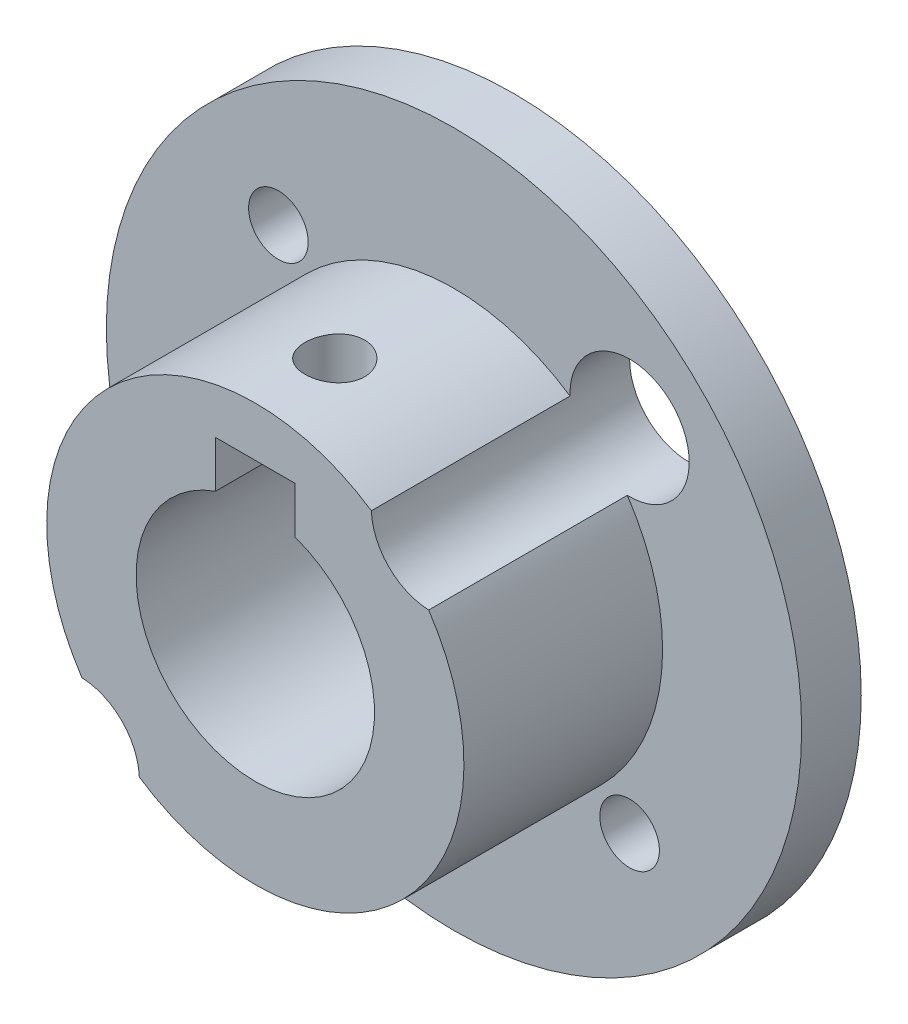
ISO-10303-21;
HEADER;
FILE_DESCRIPTION(('STEP AP214'),'2;1');
FILE_NAME('part.step','',(''),(''),'','','');
FILE_SCHEMA(('AUTOMOTIVE_DESIGN { 1 0 10303 214 1 1 1 1 }'));
ENDSEC;
DATA;
#1=APPLICATION_CONTEXT('core data for automotive mechanical design processes');
#2=APPLICATION_PROTOCOL_DEFINITION('international standard','automotive_design',2000,#1);
#3=PRODUCT_CONTEXT('',#1,'mechanical');
#4=PRODUCT('Part','Part','',(#3));
#5=PRODUCT_RELATED_PRODUCT_CATEGORY('part','',(#4));
#6=PRODUCT_DEFINITION_FORMATION('','',#4);
#7=PRODUCT_DEFINITION_CONTEXT('part definition',#1,'design');
#8=PRODUCT_DEFINITION('design','',#6,#7);
#9=PRODUCT_DEFINITION_SHAPE('','',#8);
#10=(LENGTH_UNIT() NAMED_UNIT(*) SI_UNIT(.MILLI.,.METRE.));
#11=(NAMED_UNIT(*) PLANE_ANGLE_UNIT() SI_UNIT($,.RADIAN.));
#12=(NAMED_UNIT(*) SI_UNIT($,.STERADIAN.) SOLID_ANGLE_UNIT());
#13=UNCERTAINTY_MEASURE_WITH_UNIT(LENGTH_MEASURE(1.E-05),#10,'distance_accuracy_value','');
#14=(GEOMETRIC_REPRESENTATION_CONTEXT(3) GLOBAL_UNCERTAINTY_ASSIGNED_CONTEXT((#13)) GLOBAL_UNIT_ASSIGNED_CONTEXT((#10,
#11,#12)) REPRESENTATION_CONTEXT('',''));
#15=CARTESIAN_POINT('',(0.,0.,0.));
#16=DIRECTION('',(0.,0.,1.));
#17=DIRECTION('',(1.,0.,0.));
#18=AXIS2_PLACEMENT_3D('',#15,#16,#17);
#19=CARTESIAN_POINT('',(0.,0.,10.));
#20=DIRECTION('',(0.,0.,-1.));
#21=DIRECTION('',(-1.,0.,0.));
#22=AXIS2_PLACEMENT_3D('',#19,#20,#21);
#23=CYLINDRICAL_SURFACE('',#22,10.5);
#24=CARTESIAN_POINT('',(0.,10.5,4.5));
#25=CARTESIAN_POINT('',(-0.083798047059616,10.4999987028432,4.50000348988322));
#26=CARTESIAN_POINT('',(-0.167645858243275,10.4989863030044,4.5070458107391));
#27=CARTESIAN_POINT('',(-0.333000990552121,10.4950450575882,4.53502370435099));
#28=CARTESIAN_POINT('',(-0.414505898300218,10.4921143049446,4.55597310265557));
#29=CARTESIAN_POINT('',(-0.572758015178163,10.4846659524273,4.61112909260134));
#30=CARTESIAN_POINT('',(-0.649508654024656,10.4801495125244,4.64532599523976));
#31=CARTESIAN_POINT('',(-0.796169475360476,10.4700298362088,4.72598331434304));
#32=CARTESIAN_POINT('',(-0.866080673157975,10.4644267614753,4.77244190677437));
#33=CARTESIAN_POINT('',(-0.997587975595969,10.4527130868134,4.8766562567509));
#34=CARTESIAN_POINT('',(-1.05912838620098,10.4465994865122,4.93448196428687));
#35=CARTESIAN_POINT('',(-1.17166693765294,10.4345774973183,5.05963862180949));
#36=CARTESIAN_POINT('',(-1.22266449406305,10.4286691198171,5.12697009839478));
#37=CARTESIAN_POINT('',(-1.31288381463334,10.4176973473603,5.26959767408063));
#38=CARTESIAN_POINT('',(-1.35205218821083,10.4126378279944,5.34492786942773));
#39=CARTESIAN_POINT('',(-1.41716017750215,10.4039772398443,5.50118180923658));
#40=CARTESIAN_POINT('',(-1.44310044681748,10.4003760990032,5.58210527710999));
#41=CARTESIAN_POINT('',(-1.48084398009175,10.3950692906489,5.74666501474203));
#42=CARTESIAN_POINT('',(-1.49274223279193,10.393350892854,5.83027907989174));
#43=CARTESIAN_POINT('',(-1.50235815011353,10.3919654076813,5.9983333581522));
#44=CARTESIAN_POINT('',(-1.50007655440469,10.3922982133056,6.08277352794108));
#45=CARTESIAN_POINT('',(-1.48147527146911,10.3949658865654,6.24941481799961));
#46=CARTESIAN_POINT('',(-1.46526102269474,10.3972857165318,6.33162798306878));
#47=CARTESIAN_POINT('',(-1.41941958482143,10.4036425753426,6.4921546294264));
#48=CARTESIAN_POINT('',(-1.38979204871222,10.4076796486131,6.57046800976675));
#49=CARTESIAN_POINT('',(-1.3178542818743,10.4170328660292,6.72129490966264));
#50=CARTESIAN_POINT('',(-1.27549903967451,10.4223535362188,6.7937866685787));
#51=CARTESIAN_POINT('',(-1.17934026858057,10.433671108351,6.93067381828395));
#52=CARTESIAN_POINT('',(-1.12553605726883,10.4396680505927,6.99506872609492));
#53=CARTESIAN_POINT('',(-1.00742618807158,10.4517290352068,7.11454560467195));
#54=CARTESIAN_POINT('',(-0.943029806366413,10.457793193268,7.16953791758994));
#55=CARTESIAN_POINT('',(-0.805873739101333,10.4692547684339,7.2679477518349));
#56=CARTESIAN_POINT('',(-0.733114022808734,10.4746521830884,7.31136523062595));
#57=CARTESIAN_POINT('',(-0.581221559720766,10.484177029702,7.38539615624894));
#58=CARTESIAN_POINT('',(-0.502085591600482,10.4883038145903,7.4160030821207));
#59=CARTESIAN_POINT('',(-0.339725024065646,10.4948168991903,7.46346820397962));
#60=CARTESIAN_POINT('',(-0.256500675473461,10.4972033055324,7.48032724228637));
#61=CARTESIAN_POINT('',(-0.0891000167924586,10.4999527092955,7.49969972011532));
#62=CARTESIAN_POINT('',(-0.00493825465679295,10.5003331021836,7.50233649485138));
#63=CARTESIAN_POINT('',(0.162626137734972,10.4990748545078,7.49351639398494));
#64=CARTESIAN_POINT('',(0.246028789182043,10.4974362704799,7.48205991302619));
#65=CARTESIAN_POINT('',(0.409336813488365,10.4923349529923,7.44548104380397));
#66=CARTESIAN_POINT('',(0.489255828690092,10.4888801904757,7.42041835561533));
#67=CARTESIAN_POINT('',(0.643757208018512,10.4805328070432,7.35740119552844));
#68=CARTESIAN_POINT('',(0.71833934181081,10.4756401241147,7.31944616761565));
#69=CARTESIAN_POINT('',(0.860594771848394,10.464917828782,7.23142963725941));
#70=CARTESIAN_POINT('',(0.928218909523478,10.4590822113691,7.18128942772091));
#71=CARTESIAN_POINT('',(1.05413647110365,10.4471433482308,7.07043594296081));
#72=CARTESIAN_POINT('',(1.11242940530894,10.4410400884811,7.0097221131865));
#73=CARTESIAN_POINT('',(1.21847523465575,10.4291991012728,6.87889747427666));
#74=CARTESIAN_POINT('',(1.26614572563628,10.4234644616138,6.80871954727461));
#75=CARTESIAN_POINT('',(1.34902176565436,10.4130635361061,6.661280110047));
#76=CARTESIAN_POINT('',(1.38422762628812,10.4083972235518,6.58401877695629));
#77=CARTESIAN_POINT('',(1.441045580689,10.4006832769632,6.42485752162028));
#78=CARTESIAN_POINT('',(1.46270197598978,10.3976303728443,6.34297368086902));
#79=CARTESIAN_POINT('',(1.49194779900115,10.3934745694833,6.1766845792083));
#80=CARTESIAN_POINT('',(1.49953810044764,10.3923715491215,6.09227947524174));
#81=CARTESIAN_POINT('',(1.50041692780658,10.3922446330881,5.92416463010904));
#82=CARTESIAN_POINT('',(1.49383498025855,10.3932019074238,5.84045555125852));
#83=CARTESIAN_POINT('',(1.466832718881,10.3970469315899,5.67534740695616));
#84=CARTESIAN_POINT('',(1.44641241931013,10.399934679431,5.59394833912423));
#85=CARTESIAN_POINT('',(1.39235734174347,10.4073089210813,5.43580105116662));
#86=CARTESIAN_POINT('',(1.35873077221951,10.4117944216327,5.35904997617772));
#87=CARTESIAN_POINT('',(1.27923048152316,10.4218600929554,5.21225816628495));
#88=CARTESIAN_POINT('',(1.2333564239388,10.4274402937947,5.14221761577646));
#89=CARTESIAN_POINT('',(1.13018960597321,10.4391274698967,5.01017563610332));
#90=CARTESIAN_POINT('',(1.07280069705274,10.4452386169774,4.94824969109832));
#91=CARTESIAN_POINT('',(0.948436134990865,10.4572636654055,4.83486021942583));
#92=CARTESIAN_POINT('',(0.881458248251207,10.4631775204,4.78339913715863));
#93=CARTESIAN_POINT('',(0.739427568400385,10.4741749686942,4.69217432097289));
#94=CARTESIAN_POINT('',(0.664336288090724,10.4792542883965,4.65247000938158));
#95=CARTESIAN_POINT('',(0.508515966277529,10.4879681705616,4.58629519199543));
#96=CARTESIAN_POINT('',(0.427792953899237,10.4916042510231,4.55981077392571));
#97=CARTESIAN_POINT('',(0.288908522998168,10.4961777225379,4.52693730981553));
#98=CARTESIAN_POINT('',(0.23161042438393,10.4976038314235,4.51685097229632));
#99=CARTESIAN_POINT('',(0.116216191024247,10.4995154149334,4.50338114318385));
#100=CARTESIAN_POINT('',(0.058120064867296,10.5000008996729,4.49999757951115));
#101=CARTESIAN_POINT('',(0.,10.5,4.5));
#102=B_SPLINE_CURVE_WITH_KNOTS('',3,(#24,#25,#26,#27,#28,#29,#30,#31,#32,#33,#34,#35,#36,#37,
#38,#39,#40,#41,#42,#43,#44,#45,#46,#47,#48,#49,#50,#51,#52,#53,#54,#55,#56,#57,#58,#59,#60,#61,
#62,#63,#64,#65,#66,#67,#68,#69,#70,#71,#72,#73,#74,#75,#76,#77,#78,#79,#80,#81,#82,#83,#84,#85,
#86,#87,#88,#89,#90,#91,#92,#93,#94,#95,#96,#97,#98,#99,#100,#101),.UNSPECIFIED.,.T.,.F.,(4,2,2,
2,2,2,2,2,2,2,2,2,2,2,2,2,2,2,2,2,2,2,2,2,2,2,2,2,2,2,2,2,2,2,2,2,2,2,4),(0.,0.251181790014658,
0.502613663993753,0.753861991045278,1.00507296375776,1.2578811514321,1.51070334962241,
1.76465016063837,2.01858442290987,2.27079088981466,2.52298420087169,2.77328562434791,
3.02359352365118,3.27479726716424,3.52601598791197,3.77951067530022,4.03300629423345,
4.28663079365746,4.54023975258936,4.79164584064564,5.04304488891045,5.29334968302705,
5.54366527353743,5.79564281989972,6.04763358566374,6.30151593543519,6.5553919380977,
6.80843346555637,7.06145927444514,7.31218238885341,7.5629052449241,7.81347250803813,
8.06404665440029,8.31680735632106,8.56962703086835,8.82370353749484,9.07751209384601,
9.25172688086821,9.42593979443109),.UNSPECIFIED.);
#103=CARTESIAN_POINT('',(0.,10.5,4.5));
#104=VERTEX_POINT('',#103);
#105=EDGE_CURVE('E225',#104,#104,#102,.T.);
#106=ORIENTED_EDGE('',*,*,#105,.F.);
#107=EDGE_LOOP('',(#106));
#108=FACE_BOUND('',#107,.T.);
#109=CARTESIAN_POINT('',(0.,0.,0.));
#110=DIRECTION('',(0.,0.,-1.));
#111=DIRECTION('',(-1.,0.,0.));
#112=AXIS2_PLACEMENT_3D('',#109,#110,#111);
#113=CIRCLE('',#112,10.5);
#114=CARTESIAN_POINT('',(-8.72542035640703,-5.84097933603585,0.));
#115=VERTEX_POINT('',#114);
#116=CARTESIAN_POINT('',(5.84097933603585,8.72542035640703,0.));
#117=VERTEX_POINT('',#116);
#118=EDGE_CURVE('E134',#115,#117,#113,.T.);
#119=ORIENTED_EDGE('',*,*,#118,.F.);
#120=DIRECTION('',(0.,0.,-1.));
#121=VECTOR('',#120,1.);
#122=CARTESIAN_POINT('',(-8.72542035640703,-5.84097933603585,3.5));
#123=LINE('',#122,#121);
#124=CARTESIAN_POINT('',(-8.72542035640703,-5.84097933603585,10.));
#125=VERTEX_POINT('',#124);
#126=EDGE_CURVE('E57',#115,#125,#123,.F.);
#127=ORIENTED_EDGE('',*,*,#126,.T.);
#128=CARTESIAN_POINT('',(0.,0.,10.));
#129=DIRECTION('',(0.,0.,1.));
#130=DIRECTION('',(1.,0.,0.));
#131=AXIS2_PLACEMENT_3D('',#128,#129,#130);
#132=CIRCLE('',#131,10.5);
#133=CARTESIAN_POINT('',(5.84097933603585,8.72542035640703,10.));
#134=VERTEX_POINT('',#133);
#135=EDGE_CURVE('E11',#134,#125,#132,.T.);
#136=ORIENTED_EDGE('',*,*,#135,.F.);
#137=DIRECTION('',(0.,0.,-1.));
#138=VECTOR('',#137,1.);
#139=CARTESIAN_POINT('',(5.84097933603585,8.72542035640703,3.5));
#140=LINE('',#139,#138);
#141=EDGE_CURVE('E147',#134,#117,#140,.T.);
#142=ORIENTED_EDGE('',*,*,#141,.T.);
#143=EDGE_LOOP('',(#119,#127,#136,#142));
#144=FACE_BOUND('',#143,.T.);
#145=ADVANCED_FACE('F38',(#108,#144),#23,.T.);
#146=CARTESIAN_POINT('',(0.,0.,10.));
#147=DIRECTION('',(0.,0.,1.));
#148=DIRECTION('',(1.,0.,0.));
#149=AXIS2_PLACEMENT_3D('',#146,#147,#148);
#150=PLANE('',#149);
#151=CARTESIAN_POINT('',(-8.83883476483185,-8.83883476483185,10.));
#152=DIRECTION('',(0.,0.,-1.));
#153=DIRECTION('',(1.,0.,0.));
#154=AXIS2_PLACEMENT_3D('',#151,#152,#153);
#155=CIRCLE('',#154,3.);
#156=CARTESIAN_POINT('',(-5.84097933603585,-8.72542035640703,10.));
#157=VERTEX_POINT('',#156);
#158=EDGE_CURVE('E120',#125,#157,#155,.T.);
#159=ORIENTED_EDGE('',*,*,#158,.T.);
#160=CARTESIAN_POINT('',(8.72542035640704,5.84097933603584,10.));
#161=VERTEX_POINT('',#160);
#162=EDGE_CURVE('E47',#157,#161,#132,.T.);
#163=ORIENTED_EDGE('',*,*,#162,.T.);
#164=CARTESIAN_POINT('',(8.83883476483185,8.83883476483184,10.));
#165=DIRECTION('',(0.,0.,-1.));
#166=DIRECTION('',(-1.,0.,0.));
#167=AXIS2_PLACEMENT_3D('',#164,#165,#166);
#168=CIRCLE('',#167,3.);
#169=EDGE_CURVE('E141',#161,#134,#168,.T.);
#170=ORIENTED_EDGE('',*,*,#169,.T.);
#171=ORIENTED_EDGE('',*,*,#135,.T.);
#172=EDGE_LOOP('',(#159,#163,#170,#171));
#173=FACE_BOUND('',#172,.T.);
#174=DIRECTION('',(0.,1.,0.));
#175=VECTOR('',#174,1.);
#176=CARTESIAN_POINT('',(2.,8.,10.));
#177=LINE('',#176,#175);
#178=CARTESIAN_POINT('',(2.,5.65685424949238,10.));
#179=VERTEX_POINT('',#178);
#180=CARTESIAN_POINT('',(2.,8.,10.));
#181=VERTEX_POINT('',#180);
#182=EDGE_CURVE('E197',#179,#181,#177,.T.);
#183=ORIENTED_EDGE('',*,*,#182,.F.);
#184=CARTESIAN_POINT('',(0.,0.,10.));
#185=DIRECTION('',(0.,0.,1.));
#186=DIRECTION('',(1.,0.,0.));
#187=AXIS2_PLACEMENT_3D('',#184,#185,#186);
#188=CIRCLE('',#187,6.);
#189=CARTESIAN_POINT('',(-2.,5.65685424949238,10.));
#190=VERTEX_POINT('',#189);
#191=EDGE_CURVE('E194',#190,#179,#188,.T.);
#192=ORIENTED_EDGE('',*,*,#191,.F.);
#193=DIRECTION('',(0.,-1.,0.));
#194=VECTOR('',#193,1.);
#195=CARTESIAN_POINT('',(-2.,8.,10.));
#196=LINE('',#195,#194);
#197=CARTESIAN_POINT('',(-2.,8.,10.));
#198=VERTEX_POINT('',#197);
#199=EDGE_CURVE('E204',#198,#190,#196,.T.);
#200=ORIENTED_EDGE('',*,*,#199,.F.);
#201=DIRECTION('',(-1.,0.,0.));
#202=VECTOR('',#201,1.);
#203=CARTESIAN_POINT('',(-2.,8.,10.));
#204=LINE('',#203,#202);
#205=EDGE_CURVE('E200',#181,#198,#204,.T.);
#206=ORIENTED_EDGE('',*,*,#205,.F.);
#207=EDGE_LOOP('',(#183,#192,#200,#206));
#208=FACE_BOUND('',#207,.T.);
#209=ADVANCED_FACE('F139',(#173,#208),#150,.T.);
#210=ORIENTED_EDGE('',*,*,#162,.F.);
#211=DIRECTION('',(0.,0.,-1.));
#212=VECTOR('',#211,1.);
#213=CARTESIAN_POINT('',(-5.84097933603585,-8.72542035640703,3.5));
#214=LINE('',#213,#212);
#215=CARTESIAN_POINT('',(-5.84097933603585,-8.72542035640703,0.));
#216=VERTEX_POINT('',#215);
#217=EDGE_CURVE('E123',#157,#216,#214,.T.);
#218=ORIENTED_EDGE('',*,*,#217,.T.);
#219=CARTESIAN_POINT('',(8.72542035640704,5.84097933603584,0.));
#220=VERTEX_POINT('',#219);
#221=EDGE_CURVE('E190',#220,#216,#113,.T.);
#222=ORIENTED_EDGE('',*,*,#221,.F.);
#223=DIRECTION('',(0.,0.,-1.));
#224=VECTOR('',#223,1.);
#225=CARTESIAN_POINT('',(8.72542035640704,5.84097933603584,3.5));
#226=LINE('',#225,#224);
#227=EDGE_CURVE('E67',#220,#161,#226,.F.);
#228=ORIENTED_EDGE('',*,*,#227,.T.);
#229=EDGE_LOOP('',(#210,#218,#222,#228));
#230=FACE_BOUND('',#229,.T.);
#231=ADVANCED_FACE('F40',(#230),#23,.T.);
#232=CARTESIAN_POINT('',(0.,0.,10.));
#233=DIRECTION('',(0.,0.,-1.));
#234=DIRECTION('',(-1.,0.,0.));
#235=AXIS2_PLACEMENT_3D('',#232,#233,#234);
#236=CYLINDRICAL_SURFACE('',#235,6.);
#237=DIRECTION('',(0.,0.,-1.));
#238=VECTOR('',#237,1.);
#239=CARTESIAN_POINT('',(2.,5.65685424949238,10.));
#240=LINE('',#239,#238);
#241=CARTESIAN_POINT('',(2.,5.65685424949238,-3.));
#242=VERTEX_POINT('',#241);
#243=EDGE_CURVE('E215',#179,#242,#240,.T.);
#244=ORIENTED_EDGE('',*,*,#243,.T.);
#245=CARTESIAN_POINT('',(0.,0.,-3.));
#246=DIRECTION('',(0.,0.,-1.));
#247=DIRECTION('',(-1.,0.,0.));
#248=AXIS2_PLACEMENT_3D('',#245,#246,#247);
#249=CIRCLE('',#248,6.);
#250=CARTESIAN_POINT('',(-2.,5.65685424949238,-3.));
#251=VERTEX_POINT('',#250);
#252=EDGE_CURVE('E174',#242,#251,#249,.T.);
#253=ORIENTED_EDGE('',*,*,#252,.T.);
#254=DIRECTION('',(0.,0.,-1.));
#255=VECTOR('',#254,1.);
#256=CARTESIAN_POINT('',(-2.,5.65685424949238,10.));
#257=LINE('',#256,#255);
#258=EDGE_CURVE('E207',#190,#251,#257,.T.);
#259=ORIENTED_EDGE('',*,*,#258,.F.);
#260=ORIENTED_EDGE('',*,*,#191,.T.);
#261=EDGE_LOOP('',(#244,#253,#259,#260));
#262=FACE_BOUND('',#261,.T.);
#263=ADVANCED_FACE('F281',(#262),#236,.F.);
#264=CARTESIAN_POINT('',(2.,8.,10.));
#265=DIRECTION('',(-1.,0.,0.));
#266=DIRECTION('',(0.,-1.,0.));
#267=AXIS2_PLACEMENT_3D('',#264,#265,#266);
#268=PLANE('',#267);
#269=DIRECTION('',(0.,0.,-1.));
#270=VECTOR('',#269,1.);
#271=CARTESIAN_POINT('',(2.,8.,10.));
#272=LINE('',#271,#270);
#273=CARTESIAN_POINT('',(2.,8.,-3.));
#274=VERTEX_POINT('',#273);
#275=EDGE_CURVE('E213',#181,#274,#272,.T.);
#276=ORIENTED_EDGE('',*,*,#275,.T.);
#277=DIRECTION('',(0.,-1.,0.));
#278=VECTOR('',#277,1.);
#279=CARTESIAN_POINT('',(2.,5.65685424949238,-3.));
#280=LINE('',#279,#278);
#281=EDGE_CURVE('E170',#274,#242,#280,.T.);
#282=ORIENTED_EDGE('',*,*,#281,.T.);
#283=ORIENTED_EDGE('',*,*,#243,.F.);
#284=ORIENTED_EDGE('',*,*,#182,.T.);
#285=EDGE_LOOP('',(#276,#282,#283,#284));
#286=FACE_BOUND('',#285,.T.);
#287=ADVANCED_FACE('F277',(#286),#268,.T.);
#288=CARTESIAN_POINT('',(-2.,8.,10.));
#289=DIRECTION('',(0.,-1.,0.));
#290=DIRECTION('',(0.,0.,-1.));
#291=AXIS2_PLACEMENT_3D('',#288,#289,#290);
#292=PLANE('',#291);
#293=CARTESIAN_POINT('',(0.,8.,6.));
#294=DIRECTION('',(0.,-1.,0.));
#295=DIRECTION('',(0.,0.,-1.));
#296=AXIS2_PLACEMENT_3D('',#293,#294,#295);
#297=CIRCLE('',#296,1.5);
#298=CARTESIAN_POINT('',(0.,8.,4.5));
#299=VERTEX_POINT('',#298);
#300=EDGE_CURVE('E223',#299,#299,#297,.T.);
#301=ORIENTED_EDGE('',*,*,#300,.F.);
#302=EDGE_LOOP('',(#301));
#303=FACE_BOUND('',#302,.T.);
#304=DIRECTION('',(0.,0.,-1.));
#305=VECTOR('',#304,1.);
#306=CARTESIAN_POINT('',(-2.,8.,10.));
#307=LINE('',#306,#305);
#308=CARTESIAN_POINT('',(-2.,8.,-3.));
#309=VERTEX_POINT('',#308);
#310=EDGE_CURVE('E210',#198,#309,#307,.T.);
#311=ORIENTED_EDGE('',*,*,#310,.T.);
#312=DIRECTION('',(1.,0.,0.));
#313=VECTOR('',#312,1.);
#314=CARTESIAN_POINT('',(2.,8.,-3.));
#315=LINE('',#314,#313);
#316=EDGE_CURVE('E166',#309,#274,#315,.T.);
#317=ORIENTED_EDGE('',*,*,#316,.T.);
#318=ORIENTED_EDGE('',*,*,#275,.F.);
#319=ORIENTED_EDGE('',*,*,#205,.T.);
#320=EDGE_LOOP('',(#311,#317,#318,#319));
#321=FACE_BOUND('',#320,.T.);
#322=ADVANCED_FACE('F273',(#303,#321),#292,.T.);
#323=CARTESIAN_POINT('',(-2.,8.,10.));
#324=DIRECTION('',(1.,0.,0.));
#325=DIRECTION('',(0.,1.,0.));
#326=AXIS2_PLACEMENT_3D('',#323,#324,#325);
#327=PLANE('',#326);
#328=ORIENTED_EDGE('',*,*,#258,.T.);
#329=DIRECTION('',(0.,1.,0.));
#330=VECTOR('',#329,1.);
#331=CARTESIAN_POINT('',(-2.,8.,-3.));
#332=LINE('',#331,#330);
#333=EDGE_CURVE('E178',#251,#309,#332,.T.);
#334=ORIENTED_EDGE('',*,*,#333,.T.);
#335=ORIENTED_EDGE('',*,*,#310,.F.);
#336=ORIENTED_EDGE('',*,*,#199,.T.);
#337=EDGE_LOOP('',(#328,#334,#335,#336));
#338=FACE_BOUND('',#337,.T.);
#339=ADVANCED_FACE('F266',(#338),#327,.T.);
#340=CARTESIAN_POINT('',(0.,0.,0.));
#341=DIRECTION('',(0.,0.,-1.));
#342=DIRECTION('',(-1.,0.,0.));
#343=AXIS2_PLACEMENT_3D('',#340,#341,#342);
#344=PLANE('',#343);
#345=CARTESIAN_POINT('',(8.83883476483184,-8.83883476483185,0.));
#346=DIRECTION('',(0.,0.,-1.));
#347=DIRECTION('',(-1.,0.,0.));
#348=AXIS2_PLACEMENT_3D('',#345,#346,#347);
#349=CIRCLE('',#348,1.5);
#350=CARTESIAN_POINT('',(7.33883476483183,-8.83883476483185,0.));
#351=VERTEX_POINT('',#350);
#352=EDGE_CURVE('E401',#351,#351,#349,.T.);
#353=ORIENTED_EDGE('',*,*,#352,.T.);
#354=EDGE_LOOP('',(#353));
#355=FACE_BOUND('',#354,.T.);
#356=CARTESIAN_POINT('',(-8.83883476483184,8.83883476483185,0.));
#357=DIRECTION('',(0.,0.,-1.));
#358=DIRECTION('',(-1.,0.,0.));
#359=AXIS2_PLACEMENT_3D('',#356,#357,#358);
#360=CIRCLE('',#359,1.5);
#361=CARTESIAN_POINT('',(-10.3388347648318,8.83883476483185,0.));
#362=VERTEX_POINT('',#361);
#363=EDGE_CURVE('E162',#362,#362,#360,.T.);
#364=ORIENTED_EDGE('',*,*,#363,.T.);
#365=EDGE_LOOP('',(#364));
#366=FACE_BOUND('',#365,.T.);
#367=CARTESIAN_POINT('',(0.,0.,0.));
#368=DIRECTION('',(0.,0.,-1.));
#369=DIRECTION('',(-1.,0.,0.));
#370=AXIS2_PLACEMENT_3D('',#367,#368,#369);
#371=CIRCLE('',#370,17.5);
#372=CARTESIAN_POINT('',(-17.5,0.,0.));
#373=VERTEX_POINT('',#372);
#374=EDGE_CURVE('E182',#373,#373,#371,.T.);
#375=ORIENTED_EDGE('',*,*,#374,.F.);
#376=EDGE_LOOP('',(#375));
#377=FACE_BOUND('',#376,.T.);
#378=ORIENTED_EDGE('',*,*,#221,.T.);
#379=CARTESIAN_POINT('',(-8.83883476483185,-8.83883476483185,0.));
#380=DIRECTION('',(0.,0.,-1.));
#381=DIRECTION('',(-1.,0.,0.));
#382=AXIS2_PLACEMENT_3D('',#379,#380,#381);
#383=CIRCLE('',#382,3.);
#384=EDGE_CURVE('E127',#216,#115,#383,.T.);
#385=ORIENTED_EDGE('',*,*,#384,.T.);
#386=ORIENTED_EDGE('',*,*,#118,.T.);
#387=CARTESIAN_POINT('',(8.83883476483185,8.83883476483184,0.));
#388=DIRECTION('',(0.,0.,-1.));
#389=DIRECTION('',(-1.,0.,0.));
#390=AXIS2_PLACEMENT_3D('',#387,#388,#389);
#391=CIRCLE('',#390,3.);
#392=EDGE_CURVE('E143',#117,#220,#391,.T.);
#393=ORIENTED_EDGE('',*,*,#392,.T.);
#394=EDGE_LOOP('',(#378,#385,#386,#393));
#395=FACE_BOUND('',#394,.T.);
#396=ADVANCED_FACE('F262',(#355,#366,#377,#395),#344,.F.);
#397=CARTESIAN_POINT('',(0.,0.,-3.));
#398=DIRECTION('',(0.,0.,-1.));
#399=DIRECTION('',(-1.,0.,0.));
#400=AXIS2_PLACEMENT_3D('',#397,#398,#399);
#401=PLANE('',#400);
#402=CARTESIAN_POINT('',(8.83883476483184,-8.83883476483185,-3.));
#403=DIRECTION('',(0.,0.,-1.));
#404=DIRECTION('',(1.,0.,0.));
#405=AXIS2_PLACEMENT_3D('',#402,#403,#404);
#406=CIRCLE('',#405,1.5);
#407=CARTESIAN_POINT('',(10.3388347648318,-8.83883476483185,-3.));
#408=VERTEX_POINT('',#407);
#409=EDGE_CURVE('E230',#408,#408,#406,.T.);
#410=ORIENTED_EDGE('',*,*,#409,.F.);
#411=EDGE_LOOP('',(#410));
#412=FACE_BOUND('',#411,.T.);
#413=CARTESIAN_POINT('',(-8.83883476483185,-8.83883476483185,-3.));
#414=DIRECTION('',(0.,0.,-1.));
#415=DIRECTION('',(1.,0.,0.));
#416=AXIS2_PLACEMENT_3D('',#413,#414,#415);
#417=CIRCLE('',#416,3.);
#418=CARTESIAN_POINT('',(-5.83883476483185,-8.83883476483185,-3.));
#419=VERTEX_POINT('',#418);
#420=EDGE_CURVE('E128',#419,#419,#417,.T.);
#421=ORIENTED_EDGE('',*,*,#420,.F.);
#422=EDGE_LOOP('',(#421));
#423=FACE_BOUND('',#422,.T.);
#424=CARTESIAN_POINT('',(8.83883476483185,8.83883476483184,-3.));
#425=DIRECTION('',(0.,0.,-1.));
#426=DIRECTION('',(-1.,0.,0.));
#427=AXIS2_PLACEMENT_3D('',#424,#425,#426);
#428=CIRCLE('',#427,3.);
#429=CARTESIAN_POINT('',(5.83883476483185,8.83883476483184,-3.));
#430=VERTEX_POINT('',#429);
#431=EDGE_CURVE('E136',#430,#430,#428,.T.);
#432=ORIENTED_EDGE('',*,*,#431,.F.);
#433=EDGE_LOOP('',(#432));
#434=FACE_BOUND('',#433,.T.);
#435=CARTESIAN_POINT('',(-8.83883476483184,8.83883476483185,-3.));
#436=DIRECTION('',(0.,0.,-1.));
#437=DIRECTION('',(-1.,0.,0.));
#438=AXIS2_PLACEMENT_3D('',#435,#436,#437);
#439=CIRCLE('',#438,1.5);
#440=CARTESIAN_POINT('',(-10.3388347648318,8.83883476483185,-3.));
#441=VERTEX_POINT('',#440);
#442=EDGE_CURVE('E158',#441,#441,#439,.T.);
#443=ORIENTED_EDGE('',*,*,#442,.F.);
#444=EDGE_LOOP('',(#443));
#445=FACE_BOUND('',#444,.T.);
#446=CARTESIAN_POINT('',(0.,0.,-3.));
#447=DIRECTION('',(0.,0.,-1.));
#448=DIRECTION('',(-1.,0.,0.));
#449=AXIS2_PLACEMENT_3D('',#446,#447,#448);
#450=CIRCLE('',#449,17.5);
#451=CARTESIAN_POINT('',(-17.5,0.,-3.));
#452=VERTEX_POINT('',#451);
#453=EDGE_CURVE('E183',#452,#452,#450,.T.);
#454=ORIENTED_EDGE('',*,*,#453,.T.);
#455=EDGE_LOOP('',(#454));
#456=FACE_BOUND('',#455,.T.);
#457=ORIENTED_EDGE('',*,*,#281,.F.);
#458=ORIENTED_EDGE('',*,*,#316,.F.);
#459=ORIENTED_EDGE('',*,*,#333,.F.);
#460=ORIENTED_EDGE('',*,*,#252,.F.);
#461=EDGE_LOOP('',(#457,#458,#459,#460));
#462=FACE_BOUND('',#461,.T.);
#463=ADVANCED_FACE('F259',(#412,#423,#434,#445,#456,#462),#401,.T.);
#464=CARTESIAN_POINT('',(0.,0.,-3.));
#465=DIRECTION('',(0.,0.,1.));
#466=DIRECTION('',(1.,0.,0.));
#467=AXIS2_PLACEMENT_3D('',#464,#465,#466);
#468=CYLINDRICAL_SURFACE('',#467,17.5);
#469=ORIENTED_EDGE('',*,*,#453,.F.);
#470=EDGE_LOOP('',(#469));
#471=FACE_BOUND('',#470,.T.);
#472=ORIENTED_EDGE('',*,*,#374,.T.);
#473=EDGE_LOOP('',(#472));
#474=FACE_BOUND('',#473,.T.);
#475=ADVANCED_FACE('F257',(#471,#474),#468,.T.);
#476=CARTESIAN_POINT('',(-8.83883476483184,8.83883476483185,10.));
#477=DIRECTION('',(0.,0.,-1.));
#478=DIRECTION('',(-1.,0.,0.));
#479=AXIS2_PLACEMENT_3D('',#476,#477,#478);
#480=CYLINDRICAL_SURFACE('',#479,1.5);
#481=ORIENTED_EDGE('',*,*,#442,.T.);
#482=EDGE_LOOP('',(#481));
#483=FACE_BOUND('',#482,.T.);
#484=ORIENTED_EDGE('',*,*,#363,.F.);
#485=EDGE_LOOP('',(#484));
#486=FACE_BOUND('',#485,.T.);
#487=ADVANCED_FACE('F253',(#483,#486),#480,.F.);
#488=CARTESIAN_POINT('',(8.83883476483185,8.83883476483184,10.));
#489=DIRECTION('',(0.,0.,-1.));
#490=DIRECTION('',(-1.,0.,0.));
#491=AXIS2_PLACEMENT_3D('',#488,#489,#490);
#492=CYLINDRICAL_SURFACE('',#491,3.);
#493=ORIENTED_EDGE('',*,*,#431,.T.);
#494=EDGE_LOOP('',(#493));
#495=FACE_BOUND('',#494,.T.);
#496=ORIENTED_EDGE('',*,*,#392,.F.);
#497=ORIENTED_EDGE('',*,*,#141,.F.);
#498=ORIENTED_EDGE('',*,*,#169,.F.);
#499=ORIENTED_EDGE('',*,*,#227,.F.);
#500=EDGE_LOOP('',(#496,#497,#498,#499));
#501=FACE_BOUND('',#500,.T.);
#502=ADVANCED_FACE('F249',(#495,#501),#492,.F.);
#503=CARTESIAN_POINT('',(-8.83883476483185,-8.83883476483185,10.));
#504=DIRECTION('',(0.,0.,-1.));
#505=DIRECTION('',(-1.,0.,0.));
#506=AXIS2_PLACEMENT_3D('',#503,#504,#505);
#507=CYLINDRICAL_SURFACE('',#506,3.);
#508=ORIENTED_EDGE('',*,*,#420,.T.);
#509=EDGE_LOOP('',(#508));
#510=FACE_BOUND('',#509,.T.);
#511=ORIENTED_EDGE('',*,*,#384,.F.);
#512=ORIENTED_EDGE('',*,*,#217,.F.);
#513=ORIENTED_EDGE('',*,*,#158,.F.);
#514=ORIENTED_EDGE('',*,*,#126,.F.);
#515=EDGE_LOOP('',(#511,#512,#513,#514));
#516=FACE_BOUND('',#515,.T.);
#517=ADVANCED_FACE('F121',(#510,#516),#507,.F.);
#518=CARTESIAN_POINT('',(8.83883476483184,-8.83883476483185,10.));
#519=DIRECTION('',(0.,0.,-1.));
#520=DIRECTION('',(-1.,0.,0.));
#521=AXIS2_PLACEMENT_3D('',#518,#519,#520);
#522=CYLINDRICAL_SURFACE('',#521,1.5);
#523=ORIENTED_EDGE('',*,*,#409,.T.);
#524=EDGE_LOOP('',(#523));
#525=FACE_BOUND('',#524,.T.);
#526=ORIENTED_EDGE('',*,*,#352,.F.);
#527=EDGE_LOOP('',(#526));
#528=FACE_BOUND('',#527,.T.);
#529=ADVANCED_FACE('F243',(#525,#528),#522,.F.);
#530=CARTESIAN_POINT('',(0.,17.501,6.));
#531=DIRECTION('',(0.,-1.,0.));
#532=DIRECTION('',(0.,0.,-1.));
#533=AXIS2_PLACEMENT_3D('',#530,#531,#532);
#534=CYLINDRICAL_SURFACE('',#533,1.5);
#535=ORIENTED_EDGE('',*,*,#300,.T.);
#536=EDGE_LOOP('',(#535));
#537=FACE_BOUND('',#536,.T.);
#538=ORIENTED_EDGE('',*,*,#105,.T.);
#539=EDGE_LOOP('',(#538));
#540=FACE_BOUND('',#539,.T.);
#541=ADVANCED_FACE('F238',(#537,#540),#534,.F.);
#542=CLOSED_SHELL('',(#145,#209,#231,#263,#287,#322,#339,#396,#463,#475,#487,#502,#517,#529,#541));
#543=MANIFOLD_SOLID_BREP('B2',#542);
#544=ADVANCED_BREP_SHAPE_REPRESENTATION('',(#18,#543),#14);
#545=SHAPE_DEFINITION_REPRESENTATION(#9,#544);
ENDSEC;
END-ISO-10303-21;
